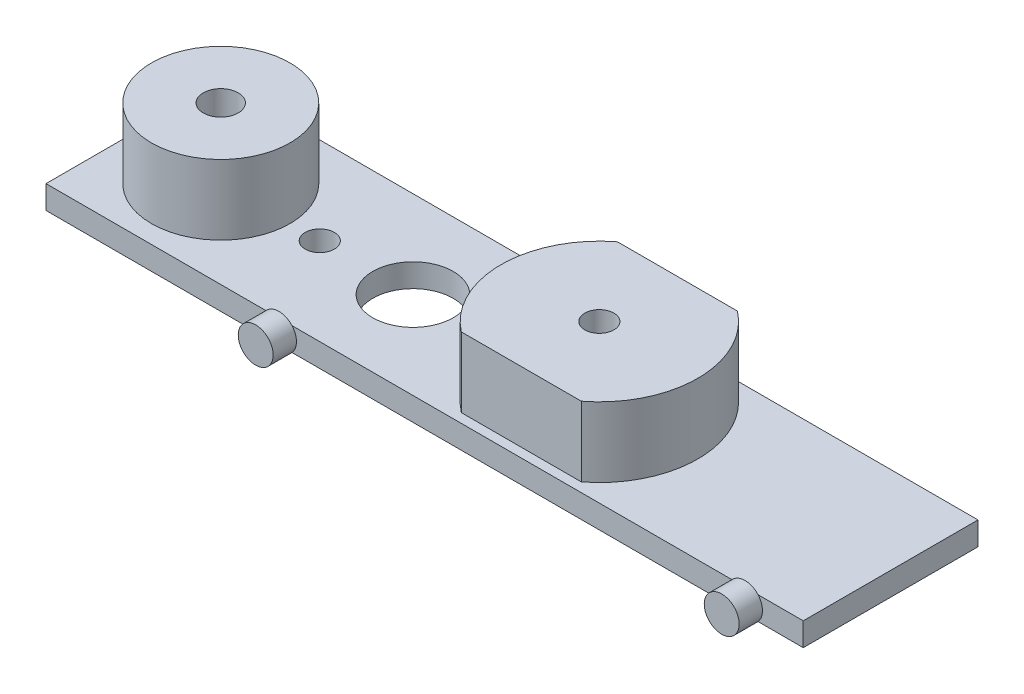
ISO-10303-21;
HEADER;
FILE_DESCRIPTION(('STEP AP214'),'2;1');
FILE_NAME('part.step','',(''),(''),'','','');
FILE_SCHEMA(('AUTOMOTIVE_DESIGN { 1 0 10303 214 1 1 1 1 }'));
ENDSEC;
DATA;
#1=APPLICATION_CONTEXT('core data for automotive mechanical design processes');
#2=APPLICATION_PROTOCOL_DEFINITION('international standard','automotive_design',2000,#1);
#3=PRODUCT_CONTEXT('',#1,'mechanical');
#4=PRODUCT('Part','Part','',(#3));
#5=PRODUCT_RELATED_PRODUCT_CATEGORY('part','',(#4));
#6=PRODUCT_DEFINITION_FORMATION('','',#4);
#7=PRODUCT_DEFINITION_CONTEXT('part definition',#1,'design');
#8=PRODUCT_DEFINITION('design','',#6,#7);
#9=PRODUCT_DEFINITION_SHAPE('','',#8);
#10=(LENGTH_UNIT() NAMED_UNIT(*) SI_UNIT(.MILLI.,.METRE.));
#11=(NAMED_UNIT(*) PLANE_ANGLE_UNIT() SI_UNIT($,.RADIAN.));
#12=(NAMED_UNIT(*) SI_UNIT($,.STERADIAN.) SOLID_ANGLE_UNIT());
#13=UNCERTAINTY_MEASURE_WITH_UNIT(LENGTH_MEASURE(1.E-05),#10,'distance_accuracy_value','');
#14=(GEOMETRIC_REPRESENTATION_CONTEXT(3) GLOBAL_UNCERTAINTY_ASSIGNED_CONTEXT((#13)) GLOBAL_UNIT_ASSIGNED_CONTEXT((#10,
#11,#12)) REPRESENTATION_CONTEXT('',''));
#15=CARTESIAN_POINT('',(0.,0.,0.));
#16=DIRECTION('',(0.,0.,1.));
#17=DIRECTION('',(1.,0.,0.));
#18=AXIS2_PLACEMENT_3D('',#15,#16,#17);
#19=CARTESIAN_POINT('',(0.,0.,0.));
#20=DIRECTION('',(0.,1.,0.));
#21=DIRECTION('',(0.,0.,1.));
#22=AXIS2_PLACEMENT_3D('',#19,#20,#21);
#23=PLANE('',#22);
#24=CARTESIAN_POINT('',(-24.,0.,0.));
#25=DIRECTION('',(0.,-1.,0.));
#26=DIRECTION('',(0.,0.,-1.));
#27=AXIS2_PLACEMENT_3D('',#24,#25,#26);
#28=CIRCLE('',#27,1.25);
#29=CARTESIAN_POINT('',(-24.,0.,-1.25));
#30=VERTEX_POINT('',#29);
#31=EDGE_CURVE('E359',#30,#30,#28,.T.);
#32=ORIENTED_EDGE('',*,*,#31,.F.);
#33=EDGE_LOOP('',(#32));
#34=FACE_BOUND('',#33,.T.);
#35=DIRECTION('',(0.,0.,-1.));
#36=VECTOR('',#35,1.);
#37=CARTESIAN_POINT('',(-40.,0.,0.));
#38=LINE('',#37,#36);
#39=CARTESIAN_POINT('',(-40.,0.,7.5));
#40=VERTEX_POINT('',#39);
#41=CARTESIAN_POINT('',(-40.,0.,-7.5));
#42=VERTEX_POINT('',#41);
#43=EDGE_CURVE('E385',#40,#42,#38,.T.);
#44=ORIENTED_EDGE('',*,*,#43,.T.);
#45=DIRECTION('',(-1.,0.,0.));
#46=VECTOR('',#45,1.);
#47=CARTESIAN_POINT('',(0.,0.,-7.5));
#48=LINE('',#47,#46);
#49=CARTESIAN_POINT('',(25.,0.,-7.5));
#50=VERTEX_POINT('',#49);
#51=EDGE_CURVE('E376',#50,#42,#48,.T.);
#52=ORIENTED_EDGE('',*,*,#51,.F.);
#53=DIRECTION('',(0.,0.,1.));
#54=VECTOR('',#53,1.);
#55=CARTESIAN_POINT('',(25.,0.,-7.5));
#56=LINE('',#55,#54);
#57=CARTESIAN_POINT('',(25.,0.,7.5));
#58=VERTEX_POINT('',#57);
#59=EDGE_CURVE('E364',#50,#58,#56,.T.);
#60=ORIENTED_EDGE('',*,*,#59,.T.);
#61=DIRECTION('',(-1.,0.,0.));
#62=VECTOR('',#61,1.);
#63=CARTESIAN_POINT('',(0.,0.,7.5));
#64=LINE('',#63,#62);
#65=CARTESIAN_POINT('',(21.1180339887499,0.,7.5));
#66=VERTEX_POINT('',#65);
#67=EDGE_CURVE('E391',#58,#66,#64,.T.);
#68=ORIENTED_EDGE('',*,*,#67,.T.);
#69=CARTESIAN_POINT('',(18.8819660112501,0.,7.5));
#70=VERTEX_POINT('',#69);
#71=EDGE_CURVE('E395',#66,#70,#64,.T.);
#72=ORIENTED_EDGE('',*,*,#71,.T.);
#73=CARTESIAN_POINT('',(-18.8819660112501,0.,7.5));
#74=VERTEX_POINT('',#73);
#75=EDGE_CURVE('E848',#70,#74,#64,.T.);
#76=ORIENTED_EDGE('',*,*,#75,.T.);
#77=CARTESIAN_POINT('',(-21.1180339887499,0.,7.5));
#78=VERTEX_POINT('',#77);
#79=EDGE_CURVE('E850',#74,#78,#64,.T.);
#80=ORIENTED_EDGE('',*,*,#79,.T.);
#81=EDGE_CURVE('E389',#78,#40,#64,.T.);
#82=ORIENTED_EDGE('',*,*,#81,.T.);
#83=EDGE_LOOP('',(#44,#52,#60,#68,#72,#76,#80,#82));
#84=FACE_BOUND('',#83,.T.);
#85=CARTESIAN_POINT('',(-16.,0.,0.));
#86=DIRECTION('',(0.,-1.,0.));
#87=DIRECTION('',(0.,0.,-1.));
#88=AXIS2_PLACEMENT_3D('',#85,#86,#87);
#89=CIRCLE('',#88,3.45);
#90=CARTESIAN_POINT('',(-16.,0.,-3.45));
#91=VERTEX_POINT('',#90);
#92=EDGE_CURVE('E360',#91,#91,#89,.T.);
#93=ORIENTED_EDGE('',*,*,#92,.F.);
#94=EDGE_LOOP('',(#93));
#95=FACE_BOUND('',#94,.T.);
#96=CARTESIAN_POINT('',(-32.5,0.,0.));
#97=DIRECTION('',(0.,1.,0.));
#98=DIRECTION('',(0.,0.,1.));
#99=AXIS2_PLACEMENT_3D('',#96,#97,#98);
#100=CIRCLE('',#99,5.25);
#101=CARTESIAN_POINT('',(-32.5,0.,5.25));
#102=VERTEX_POINT('',#101);
#103=EDGE_CURVE('E273',#102,#102,#100,.T.);
#104=ORIENTED_EDGE('',*,*,#103,.T.);
#105=EDGE_LOOP('',(#104));
#106=FACE_BOUND('',#105,.T.);
#107=DIRECTION('',(-1.,0.,0.));
#108=VECTOR('',#107,1.);
#109=CARTESIAN_POINT('',(0.,0.,6.));
#110=LINE('',#109,#108);
#111=CARTESIAN_POINT('',(4.90535421758714,0.,6.));
#112=VERTEX_POINT('',#111);
#113=CARTESIAN_POINT('',(-4.90535421758714,0.,6.));
#114=VERTEX_POINT('',#113);
#115=EDGE_CURVE('E13',#112,#114,#110,.T.);
#116=ORIENTED_EDGE('',*,*,#115,.F.);
#117=CARTESIAN_POINT('',(0.,0.,0.));
#118=DIRECTION('',(0.,1.,0.));
#119=DIRECTION('',(0.,0.,1.));
#120=AXIS2_PLACEMENT_3D('',#117,#118,#119);
#121=CIRCLE('',#120,7.75);
#122=CARTESIAN_POINT('',(4.90535421758714,0.,-6.));
#123=VERTEX_POINT('',#122);
#124=EDGE_CURVE('E422',#112,#123,#121,.T.);
#125=ORIENTED_EDGE('',*,*,#124,.T.);
#126=DIRECTION('',(-1.,0.,0.));
#127=VECTOR('',#126,1.);
#128=CARTESIAN_POINT('',(0.,0.,-6.));
#129=LINE('',#128,#127);
#130=CARTESIAN_POINT('',(-4.90535421758714,0.,-6.));
#131=VERTEX_POINT('',#130);
#132=EDGE_CURVE('E426',#123,#131,#129,.T.);
#133=ORIENTED_EDGE('',*,*,#132,.T.);
#134=CARTESIAN_POINT('',(0.,0.,0.));
#135=DIRECTION('',(0.,1.,0.));
#136=DIRECTION('',(0.,0.,1.));
#137=AXIS2_PLACEMENT_3D('',#134,#135,#136);
#138=CIRCLE('',#137,7.75);
#139=EDGE_CURVE('E131',#131,#114,#138,.T.);
#140=ORIENTED_EDGE('',*,*,#139,.T.);
#141=EDGE_LOOP('',(#116,#125,#133,#140));
#142=FACE_BOUND('',#141,.T.);
#143=ADVANCED_FACE('F121',(#34,#84,#95,#106,#142),#23,.F.);
#144=CARTESIAN_POINT('',(0.,2.,0.));
#145=DIRECTION('',(0.,1.,0.));
#146=DIRECTION('',(0.,0.,1.));
#147=AXIS2_PLACEMENT_3D('',#144,#145,#146);
#148=PLANE('',#147);
#149=DIRECTION('',(0.,0.,-1.));
#150=VECTOR('',#149,1.);
#151=CARTESIAN_POINT('',(-40.,2.,0.));
#152=LINE('',#151,#150);
#153=CARTESIAN_POINT('',(-40.,2.,7.5));
#154=VERTEX_POINT('',#153);
#155=CARTESIAN_POINT('',(-40.,2.,-7.5));
#156=VERTEX_POINT('',#155);
#157=EDGE_CURVE('E371',#154,#156,#152,.T.);
#158=ORIENTED_EDGE('',*,*,#157,.F.);
#159=DIRECTION('',(-1.,0.,0.));
#160=VECTOR('',#159,1.);
#161=CARTESIAN_POINT('',(0.,2.,7.5));
#162=LINE('',#161,#160);
#163=CARTESIAN_POINT('',(-21.1180339887499,2.,7.5));
#164=VERTEX_POINT('',#163);
#165=EDGE_CURVE('E375',#164,#154,#162,.T.);
#166=ORIENTED_EDGE('',*,*,#165,.F.);
#167=CARTESIAN_POINT('',(-18.8819660112501,2.,7.5));
#168=VERTEX_POINT('',#167);
#169=EDGE_CURVE('E832',#168,#164,#162,.T.);
#170=ORIENTED_EDGE('',*,*,#169,.F.);
#171=CARTESIAN_POINT('',(18.8819660112501,2.,7.5));
#172=VERTEX_POINT('',#171);
#173=EDGE_CURVE('E837',#172,#168,#162,.T.);
#174=ORIENTED_EDGE('',*,*,#173,.F.);
#175=CARTESIAN_POINT('',(21.1180339887499,2.,7.5));
#176=VERTEX_POINT('',#175);
#177=EDGE_CURVE('E381',#176,#172,#162,.T.);
#178=ORIENTED_EDGE('',*,*,#177,.F.);
#179=CARTESIAN_POINT('',(25.,2.,7.5));
#180=VERTEX_POINT('',#179);
#181=EDGE_CURVE('E377',#180,#176,#162,.T.);
#182=ORIENTED_EDGE('',*,*,#181,.F.);
#183=DIRECTION('',(0.,0.,1.));
#184=VECTOR('',#183,1.);
#185=CARTESIAN_POINT('',(25.,2.,-7.5));
#186=LINE('',#185,#184);
#187=CARTESIAN_POINT('',(25.,2.,-7.5));
#188=VERTEX_POINT('',#187);
#189=EDGE_CURVE('E405',#188,#180,#186,.T.);
#190=ORIENTED_EDGE('',*,*,#189,.F.);
#191=DIRECTION('',(-1.,0.,0.));
#192=VECTOR('',#191,1.);
#193=CARTESIAN_POINT('',(0.,2.,-7.5));
#194=LINE('',#193,#192);
#195=EDGE_CURVE('E380',#188,#156,#194,.T.);
#196=ORIENTED_EDGE('',*,*,#195,.T.);
#197=EDGE_LOOP('',(#158,#166,#170,#174,#178,#182,#190,#196));
#198=FACE_BOUND('',#197,.T.);
#199=CARTESIAN_POINT('',(-16.,2.,0.));
#200=DIRECTION('',(0.,1.,0.));
#201=DIRECTION('',(0.,0.,1.));
#202=AXIS2_PLACEMENT_3D('',#199,#200,#201);
#203=CIRCLE('',#202,3.45);
#204=CARTESIAN_POINT('',(-16.,2.,3.45));
#205=VERTEX_POINT('',#204);
#206=EDGE_CURVE('E339',#205,#205,#203,.F.);
#207=ORIENTED_EDGE('',*,*,#206,.T.);
#208=EDGE_LOOP('',(#207));
#209=FACE_BOUND('',#208,.T.);
#210=CARTESIAN_POINT('',(-24.,2.,0.));
#211=DIRECTION('',(0.,1.,0.));
#212=DIRECTION('',(0.,0.,1.));
#213=AXIS2_PLACEMENT_3D('',#210,#211,#212);
#214=CIRCLE('',#213,1.25);
#215=CARTESIAN_POINT('',(-24.,2.,1.25000000000001));
#216=VERTEX_POINT('',#215);
#217=EDGE_CURVE('E355',#216,#216,#214,.F.);
#218=ORIENTED_EDGE('',*,*,#217,.T.);
#219=EDGE_LOOP('',(#218));
#220=FACE_BOUND('',#219,.T.);
#221=DIRECTION('',(-1.,0.,0.));
#222=VECTOR('',#221,1.);
#223=CARTESIAN_POINT('',(5.14902903468217,2.,-6.7));
#224=LINE('',#223,#222);
#225=CARTESIAN_POINT('',(5.14902903468217,2.,-6.7));
#226=VERTEX_POINT('',#225);
#227=CARTESIAN_POINT('',(-5.14902903468217,2.,-6.7));
#228=VERTEX_POINT('',#227);
#229=EDGE_CURVE('E318',#226,#228,#224,.T.);
#230=ORIENTED_EDGE('',*,*,#229,.F.);
#231=CARTESIAN_POINT('',(0.,2.,0.));
#232=DIRECTION('',(0.,1.,0.));
#233=DIRECTION('',(0.,0.,1.));
#234=AXIS2_PLACEMENT_3D('',#231,#232,#233);
#235=CIRCLE('',#234,8.45);
#236=CARTESIAN_POINT('',(5.14902903468217,2.,6.7));
#237=VERTEX_POINT('',#236);
#238=EDGE_CURVE('E297',#237,#226,#235,.T.);
#239=ORIENTED_EDGE('',*,*,#238,.F.);
#240=DIRECTION('',(1.,0.,0.));
#241=VECTOR('',#240,1.);
#242=CARTESIAN_POINT('',(5.14902903468217,2.,6.7));
#243=LINE('',#242,#241);
#244=CARTESIAN_POINT('',(-5.14902903468217,2.,6.7));
#245=VERTEX_POINT('',#244);
#246=EDGE_CURVE('E311',#245,#237,#243,.T.);
#247=ORIENTED_EDGE('',*,*,#246,.F.);
#248=CARTESIAN_POINT('',(0.,2.,0.));
#249=DIRECTION('',(0.,1.,0.));
#250=DIRECTION('',(0.,0.,1.));
#251=AXIS2_PLACEMENT_3D('',#248,#249,#250);
#252=CIRCLE('',#251,8.45);
#253=EDGE_CURVE('E314',#228,#245,#252,.T.);
#254=ORIENTED_EDGE('',*,*,#253,.F.);
#255=EDGE_LOOP('',(#230,#239,#247,#254));
#256=FACE_BOUND('',#255,.T.);
#257=CARTESIAN_POINT('',(-32.5,2.,0.));
#258=DIRECTION('',(0.,1.,0.));
#259=DIRECTION('',(0.,0.,1.));
#260=AXIS2_PLACEMENT_3D('',#257,#258,#259);
#261=CIRCLE('',#260,5.95);
#262=CARTESIAN_POINT('',(-32.5,2.,5.95));
#263=VERTEX_POINT('',#262);
#264=EDGE_CURVE('E293',#263,#263,#261,.T.);
#265=ORIENTED_EDGE('',*,*,#264,.F.);
#266=EDGE_LOOP('',(#265));
#267=FACE_BOUND('',#266,.T.);
#268=ADVANCED_FACE('F452',(#198,#209,#220,#256,#267),#148,.T.);
#269=CARTESIAN_POINT('',(0.,2.,7.5));
#270=DIRECTION('',(0.,0.,1.));
#271=DIRECTION('',(1.,0.,0.));
#272=AXIS2_PLACEMENT_3D('',#269,#270,#271);
#273=PLANE('',#272);
#274=CARTESIAN_POINT('',(20.,0.999999999999999,7.5));
#275=DIRECTION('',(0.,0.,1.));
#276=DIRECTION('',(1.,0.,0.));
#277=AXIS2_PLACEMENT_3D('',#274,#275,#276);
#278=CIRCLE('',#277,1.5);
#279=EDGE_CURVE('E427',#172,#70,#278,.T.);
#280=ORIENTED_EDGE('',*,*,#279,.F.);
#281=ORIENTED_EDGE('',*,*,#173,.T.);
#282=CARTESIAN_POINT('',(-20.,0.999999999999995,7.5));
#283=DIRECTION('',(0.,0.,1.));
#284=DIRECTION('',(1.,0.,0.));
#285=AXIS2_PLACEMENT_3D('',#282,#283,#284);
#286=CIRCLE('',#285,1.5);
#287=EDGE_CURVE('E351',#74,#168,#286,.T.);
#288=ORIENTED_EDGE('',*,*,#287,.F.);
#289=ORIENTED_EDGE('',*,*,#75,.F.);
#290=EDGE_LOOP('',(#280,#281,#288,#289));
#291=FACE_BOUND('',#290,.T.);
#292=ADVANCED_FACE('F459',(#291),#273,.T.);
#293=EDGE_CURVE('E820',#164,#78,#286,.T.);
#294=ORIENTED_EDGE('',*,*,#293,.F.);
#295=ORIENTED_EDGE('',*,*,#165,.T.);
#296=DIRECTION('',(0.,-1.,0.));
#297=VECTOR('',#296,1.);
#298=CARTESIAN_POINT('',(-40.,2.,7.5));
#299=LINE('',#298,#297);
#300=EDGE_CURVE('E401',#154,#40,#299,.T.);
#301=ORIENTED_EDGE('',*,*,#300,.T.);
#302=ORIENTED_EDGE('',*,*,#81,.F.);
#303=EDGE_LOOP('',(#294,#295,#301,#302));
#304=FACE_BOUND('',#303,.T.);
#305=ADVANCED_FACE('F470',(#304),#273,.T.);
#306=CARTESIAN_POINT('',(0.,2.,-7.5));
#307=DIRECTION('',(0.,0.,1.));
#308=DIRECTION('',(1.,0.,0.));
#309=AXIS2_PLACEMENT_3D('',#306,#307,#308);
#310=PLANE('',#309);
#311=ORIENTED_EDGE('',*,*,#51,.T.);
#312=DIRECTION('',(0.,-1.,0.));
#313=VECTOR('',#312,1.);
#314=CARTESIAN_POINT('',(-40.,2.,-7.5));
#315=LINE('',#314,#313);
#316=EDGE_CURVE('E384',#156,#42,#315,.T.);
#317=ORIENTED_EDGE('',*,*,#316,.F.);
#318=ORIENTED_EDGE('',*,*,#195,.F.);
#319=DIRECTION('',(0.,-1.,0.));
#320=VECTOR('',#319,1.);
#321=CARTESIAN_POINT('',(25.,2.,-7.5));
#322=LINE('',#321,#320);
#323=EDGE_CURVE('E409',#188,#50,#322,.T.);
#324=ORIENTED_EDGE('',*,*,#323,.T.);
#325=EDGE_LOOP('',(#311,#317,#318,#324));
#326=FACE_BOUND('',#325,.T.);
#327=ADVANCED_FACE('F466',(#326),#310,.F.);
#328=EDGE_CURVE('E345',#66,#176,#278,.T.);
#329=ORIENTED_EDGE('',*,*,#328,.F.);
#330=ORIENTED_EDGE('',*,*,#67,.F.);
#331=DIRECTION('',(0.,-1.,0.));
#332=VECTOR('',#331,1.);
#333=CARTESIAN_POINT('',(25.,2.,7.5));
#334=LINE('',#333,#332);
#335=EDGE_CURVE('E390',#180,#58,#334,.T.);
#336=ORIENTED_EDGE('',*,*,#335,.F.);
#337=ORIENTED_EDGE('',*,*,#181,.T.);
#338=EDGE_LOOP('',(#329,#330,#336,#337));
#339=FACE_BOUND('',#338,.T.);
#340=ADVANCED_FACE('F469',(#339),#273,.T.);
#341=CARTESIAN_POINT('',(-40.,2.,0.));
#342=DIRECTION('',(-1.,0.,0.));
#343=DIRECTION('',(0.,0.,1.));
#344=AXIS2_PLACEMENT_3D('',#341,#342,#343);
#345=PLANE('',#344);
#346=ORIENTED_EDGE('',*,*,#43,.F.);
#347=ORIENTED_EDGE('',*,*,#300,.F.);
#348=ORIENTED_EDGE('',*,*,#157,.T.);
#349=ORIENTED_EDGE('',*,*,#316,.T.);
#350=EDGE_LOOP('',(#346,#347,#348,#349));
#351=FACE_BOUND('',#350,.T.);
#352=ADVANCED_FACE('F473',(#351),#345,.T.);
#353=CARTESIAN_POINT('',(25.,2.,-7.5));
#354=DIRECTION('',(1.,0.,0.));
#355=DIRECTION('',(0.,0.,-1.));
#356=AXIS2_PLACEMENT_3D('',#353,#354,#355);
#357=PLANE('',#356);
#358=ORIENTED_EDGE('',*,*,#59,.F.);
#359=ORIENTED_EDGE('',*,*,#323,.F.);
#360=ORIENTED_EDGE('',*,*,#189,.T.);
#361=ORIENTED_EDGE('',*,*,#335,.T.);
#362=EDGE_LOOP('',(#358,#359,#360,#361));
#363=FACE_BOUND('',#362,.T.);
#364=ADVANCED_FACE('F123',(#363),#357,.T.);
#365=CARTESIAN_POINT('',(-16.,11.7580735803744,0.));
#366=DIRECTION('',(0.,-1.,0.));
#367=DIRECTION('',(0.,0.,-1.));
#368=AXIS2_PLACEMENT_3D('',#365,#366,#367);
#369=CYLINDRICAL_SURFACE('',#368,3.45);
#370=ORIENTED_EDGE('',*,*,#92,.T.);
#371=EDGE_LOOP('',(#370));
#372=FACE_BOUND('',#371,.T.);
#373=ORIENTED_EDGE('',*,*,#206,.F.);
#374=EDGE_LOOP('',(#373));
#375=FACE_BOUND('',#374,.T.);
#376=ADVANCED_FACE('F477',(#372,#375),#369,.F.);
#377=CARTESIAN_POINT('',(-24.,11.7580735803744,0.));
#378=DIRECTION('',(0.,-1.,0.));
#379=DIRECTION('',(0.,0.,-1.));
#380=AXIS2_PLACEMENT_3D('',#377,#378,#379);
#381=CYLINDRICAL_SURFACE('',#380,1.25);
#382=ORIENTED_EDGE('',*,*,#31,.T.);
#383=EDGE_LOOP('',(#382));
#384=FACE_BOUND('',#383,.T.);
#385=ORIENTED_EDGE('',*,*,#217,.F.);
#386=EDGE_LOOP('',(#385));
#387=FACE_BOUND('',#386,.T.);
#388=ADVANCED_FACE('F484',(#384,#387),#381,.F.);
#389=CARTESIAN_POINT('',(0.,11.7580735803744,0.));
#390=DIRECTION('',(0.,-1.,0.));
#391=DIRECTION('',(0.,0.,-1.));
#392=AXIS2_PLACEMENT_3D('',#389,#390,#391);
#393=CYLINDRICAL_SURFACE('',#392,1.25);
#394=CARTESIAN_POINT('',(0.,5.5,0.));
#395=DIRECTION('',(0.,1.,0.));
#396=DIRECTION('',(0.,0.,1.));
#397=AXIS2_PLACEMENT_3D('',#394,#395,#396);
#398=CIRCLE('',#397,1.25);
#399=CARTESIAN_POINT('',(0.,5.5,1.25));
#400=VERTEX_POINT('',#399);
#401=EDGE_CURVE('E258',#400,#400,#398,.F.);
#402=ORIENTED_EDGE('',*,*,#401,.T.);
#403=EDGE_LOOP('',(#402));
#404=FACE_BOUND('',#403,.T.);
#405=CARTESIAN_POINT('',(0.,8.,0.));
#406=DIRECTION('',(0.,1.,0.));
#407=DIRECTION('',(0.,0.,1.));
#408=AXIS2_PLACEMENT_3D('',#405,#406,#407);
#409=CIRCLE('',#408,1.25);
#410=CARTESIAN_POINT('',(0.,8.,1.25));
#411=VERTEX_POINT('',#410);
#412=EDGE_CURVE('E283',#411,#411,#409,.F.);
#413=ORIENTED_EDGE('',*,*,#412,.F.);
#414=EDGE_LOOP('',(#413));
#415=FACE_BOUND('',#414,.T.);
#416=ADVANCED_FACE('F489',(#404,#415),#393,.F.);
#417=CARTESIAN_POINT('',(-20.,0.999999999999995,7.5));
#418=DIRECTION('',(0.,0.,1.));
#419=DIRECTION('',(1.,0.,0.));
#420=AXIS2_PLACEMENT_3D('',#417,#418,#419);
#421=PLANE('',#420);
#422=EDGE_CURVE('E346',#168,#164,#286,.T.);
#423=ORIENTED_EDGE('',*,*,#422,.F.);
#424=ORIENTED_EDGE('',*,*,#169,.T.);
#425=EDGE_LOOP('',(#423,#424));
#426=FACE_BOUND('',#425,.T.);
#427=ADVANCED_FACE('F495',(#426),#421,.F.);
#428=CARTESIAN_POINT('',(-20.,0.999999999999995,9.5));
#429=DIRECTION('',(0.,0.,-1.));
#430=DIRECTION('',(-1.,0.,0.));
#431=AXIS2_PLACEMENT_3D('',#428,#429,#430);
#432=CYLINDRICAL_SURFACE('',#431,1.5);
#433=CARTESIAN_POINT('',(-20.,0.999999999999995,9.5));
#434=DIRECTION('',(0.,0.,1.));
#435=DIRECTION('',(1.,0.,0.));
#436=AXIS2_PLACEMENT_3D('',#433,#434,#435);
#437=CIRCLE('',#436,1.5);
#438=CARTESIAN_POINT('',(-18.5,0.999999999999995,9.5));
#439=VERTEX_POINT('',#438);
#440=EDGE_CURVE('E292',#439,#439,#437,.T.);
#441=ORIENTED_EDGE('',*,*,#440,.F.);
#442=EDGE_LOOP('',(#441));
#443=FACE_BOUND('',#442,.T.);
#444=ORIENTED_EDGE('',*,*,#422,.T.);
#445=ORIENTED_EDGE('',*,*,#293,.T.);
#446=EDGE_CURVE('E350',#78,#74,#286,.T.);
#447=ORIENTED_EDGE('',*,*,#446,.T.);
#448=ORIENTED_EDGE('',*,*,#287,.T.);
#449=EDGE_LOOP('',(#444,#445,#447,#448));
#450=FACE_BOUND('',#449,.T.);
#451=ADVANCED_FACE('F501',(#443,#450),#432,.T.);
#452=CARTESIAN_POINT('',(-20.,0.999999999999995,9.5));
#453=DIRECTION('',(0.,0.,1.));
#454=DIRECTION('',(1.,0.,0.));
#455=AXIS2_PLACEMENT_3D('',#452,#453,#454);
#456=PLANE('',#455);
#457=ORIENTED_EDGE('',*,*,#440,.T.);
#458=EDGE_LOOP('',(#457));
#459=FACE_BOUND('',#458,.T.);
#460=ADVANCED_FACE('F497',(#459),#456,.T.);
#461=ORIENTED_EDGE('',*,*,#79,.F.);
#462=ORIENTED_EDGE('',*,*,#446,.F.);
#463=EDGE_LOOP('',(#461,#462));
#464=FACE_BOUND('',#463,.T.);
#465=ADVANCED_FACE('F500',(#464),#421,.F.);
#466=CARTESIAN_POINT('',(20.,0.999999999999999,7.5));
#467=DIRECTION('',(0.,0.,1.));
#468=DIRECTION('',(1.,0.,0.));
#469=AXIS2_PLACEMENT_3D('',#466,#467,#468);
#470=PLANE('',#469);
#471=EDGE_CURVE('E340',#176,#172,#278,.T.);
#472=ORIENTED_EDGE('',*,*,#471,.F.);
#473=ORIENTED_EDGE('',*,*,#177,.T.);
#474=EDGE_LOOP('',(#472,#473));
#475=FACE_BOUND('',#474,.T.);
#476=ADVANCED_FACE('F505',(#475),#470,.F.);
#477=CARTESIAN_POINT('',(20.,0.999999999999999,9.5));
#478=DIRECTION('',(0.,0.,-1.));
#479=DIRECTION('',(-1.,0.,0.));
#480=AXIS2_PLACEMENT_3D('',#477,#478,#479);
#481=CYLINDRICAL_SURFACE('',#480,1.5);
#482=CARTESIAN_POINT('',(20.,0.999999999999999,9.5));
#483=DIRECTION('',(0.,0.,1.));
#484=DIRECTION('',(1.,0.,0.));
#485=AXIS2_PLACEMENT_3D('',#482,#483,#484);
#486=CIRCLE('',#485,1.5);
#487=CARTESIAN_POINT('',(21.5,0.999999999999999,9.5));
#488=VERTEX_POINT('',#487);
#489=EDGE_CURVE('E335',#488,#488,#486,.T.);
#490=ORIENTED_EDGE('',*,*,#489,.F.);
#491=EDGE_LOOP('',(#490));
#492=FACE_BOUND('',#491,.T.);
#493=ORIENTED_EDGE('',*,*,#471,.T.);
#494=ORIENTED_EDGE('',*,*,#279,.T.);
#495=EDGE_CURVE('E344',#70,#66,#278,.T.);
#496=ORIENTED_EDGE('',*,*,#495,.T.);
#497=ORIENTED_EDGE('',*,*,#328,.T.);
#498=EDGE_LOOP('',(#493,#494,#496,#497));
#499=FACE_BOUND('',#498,.T.);
#500=ADVANCED_FACE('F510',(#492,#499),#481,.T.);
#501=CARTESIAN_POINT('',(20.,0.999999999999999,9.5));
#502=DIRECTION('',(0.,0.,1.));
#503=DIRECTION('',(1.,0.,0.));
#504=AXIS2_PLACEMENT_3D('',#501,#502,#503);
#505=PLANE('',#504);
#506=ORIENTED_EDGE('',*,*,#489,.T.);
#507=EDGE_LOOP('',(#506));
#508=FACE_BOUND('',#507,.T.);
#509=ADVANCED_FACE('F513',(#508),#505,.T.);
#510=ORIENTED_EDGE('',*,*,#71,.F.);
#511=ORIENTED_EDGE('',*,*,#495,.F.);
#512=EDGE_LOOP('',(#510,#511));
#513=FACE_BOUND('',#512,.T.);
#514=ADVANCED_FACE('F515',(#513),#470,.F.);
#515=CARTESIAN_POINT('',(0.,8.,0.));
#516=DIRECTION('',(0.,1.,0.));
#517=DIRECTION('',(0.,0.,1.));
#518=AXIS2_PLACEMENT_3D('',#515,#516,#517);
#519=PLANE('',#518);
#520=CARTESIAN_POINT('',(0.,8.,0.));
#521=DIRECTION('',(0.,1.,0.));
#522=DIRECTION('',(0.,0.,1.));
#523=AXIS2_PLACEMENT_3D('',#520,#521,#522);
#524=CIRCLE('',#523,8.45);
#525=CARTESIAN_POINT('',(5.14902903468217,8.,6.7));
#526=VERTEX_POINT('',#525);
#527=CARTESIAN_POINT('',(5.14902903468217,8.,-6.7));
#528=VERTEX_POINT('',#527);
#529=EDGE_CURVE('E315',#526,#528,#524,.T.);
#530=ORIENTED_EDGE('',*,*,#529,.T.);
#531=DIRECTION('',(-1.,0.,0.));
#532=VECTOR('',#531,1.);
#533=CARTESIAN_POINT('',(5.14902903468217,8.,-6.7));
#534=LINE('',#533,#532);
#535=CARTESIAN_POINT('',(-5.14902903468217,8.,-6.7));
#536=VERTEX_POINT('',#535);
#537=EDGE_CURVE('E329',#528,#536,#534,.T.);
#538=ORIENTED_EDGE('',*,*,#537,.T.);
#539=CARTESIAN_POINT('',(0.,8.,0.));
#540=DIRECTION('',(0.,1.,0.));
#541=DIRECTION('',(0.,0.,1.));
#542=AXIS2_PLACEMENT_3D('',#539,#540,#541);
#543=CIRCLE('',#542,8.45);
#544=CARTESIAN_POINT('',(-5.14902903468217,8.,6.7));
#545=VERTEX_POINT('',#544);
#546=EDGE_CURVE('E326',#536,#545,#543,.T.);
#547=ORIENTED_EDGE('',*,*,#546,.T.);
#548=DIRECTION('',(1.,0.,0.));
#549=VECTOR('',#548,1.);
#550=CARTESIAN_POINT('',(5.14902903468217,8.,6.7));
#551=LINE('',#550,#549);
#552=EDGE_CURVE('E310',#545,#526,#551,.T.);
#553=ORIENTED_EDGE('',*,*,#552,.T.);
#554=EDGE_LOOP('',(#530,#538,#547,#553));
#555=FACE_BOUND('',#554,.T.);
#556=ORIENTED_EDGE('',*,*,#412,.T.);
#557=EDGE_LOOP('',(#556));
#558=FACE_BOUND('',#557,.T.);
#559=ADVANCED_FACE('F518',(#555,#558),#519,.T.);
#560=CARTESIAN_POINT('',(0.,8.,0.));
#561=DIRECTION('',(0.,-1.,0.));
#562=DIRECTION('',(0.,0.,-1.));
#563=AXIS2_PLACEMENT_3D('',#560,#561,#562);
#564=CYLINDRICAL_SURFACE('',#563,8.45);
#565=ORIENTED_EDGE('',*,*,#238,.T.);
#566=DIRECTION('',(0.,-1.,0.));
#567=VECTOR('',#566,1.);
#568=CARTESIAN_POINT('',(5.14902903468217,8.,-6.7));
#569=LINE('',#568,#567);
#570=EDGE_CURVE('E287',#528,#226,#569,.T.);
#571=ORIENTED_EDGE('',*,*,#570,.F.);
#572=ORIENTED_EDGE('',*,*,#529,.F.);
#573=DIRECTION('',(0.,-1.,0.));
#574=VECTOR('',#573,1.);
#575=CARTESIAN_POINT('',(5.14902903468217,8.,6.7));
#576=LINE('',#575,#574);
#577=EDGE_CURVE('E306',#526,#237,#576,.T.);
#578=ORIENTED_EDGE('',*,*,#577,.T.);
#579=EDGE_LOOP('',(#565,#571,#572,#578));
#580=FACE_BOUND('',#579,.T.);
#581=ADVANCED_FACE('F524',(#580),#564,.T.);
#582=CARTESIAN_POINT('',(5.14902903468217,8.,-6.7));
#583=DIRECTION('',(0.,0.,1.));
#584=DIRECTION('',(1.,0.,0.));
#585=AXIS2_PLACEMENT_3D('',#582,#583,#584);
#586=PLANE('',#585);
#587=ORIENTED_EDGE('',*,*,#229,.T.);
#588=DIRECTION('',(0.,-1.,0.));
#589=VECTOR('',#588,1.);
#590=CARTESIAN_POINT('',(-5.14902903468217,8.,-6.7));
#591=LINE('',#590,#589);
#592=EDGE_CURVE('E300',#536,#228,#591,.T.);
#593=ORIENTED_EDGE('',*,*,#592,.F.);
#594=ORIENTED_EDGE('',*,*,#537,.F.);
#595=ORIENTED_EDGE('',*,*,#570,.T.);
#596=EDGE_LOOP('',(#587,#593,#594,#595));
#597=FACE_BOUND('',#596,.T.);
#598=ADVANCED_FACE('F532',(#597),#586,.F.);
#599=CARTESIAN_POINT('',(0.,8.,0.));
#600=DIRECTION('',(0.,-1.,0.));
#601=DIRECTION('',(0.,0.,-1.));
#602=AXIS2_PLACEMENT_3D('',#599,#600,#601);
#603=CYLINDRICAL_SURFACE('',#602,8.45);
#604=ORIENTED_EDGE('',*,*,#253,.T.);
#605=DIRECTION('',(0.,-1.,0.));
#606=VECTOR('',#605,1.);
#607=CARTESIAN_POINT('',(-5.14902903468217,8.,6.7));
#608=LINE('',#607,#606);
#609=EDGE_CURVE('E146',#545,#245,#608,.T.);
#610=ORIENTED_EDGE('',*,*,#609,.F.);
#611=ORIENTED_EDGE('',*,*,#546,.F.);
#612=ORIENTED_EDGE('',*,*,#592,.T.);
#613=EDGE_LOOP('',(#604,#610,#611,#612));
#614=FACE_BOUND('',#613,.T.);
#615=ADVANCED_FACE('F529',(#614),#603,.T.);
#616=CARTESIAN_POINT('',(5.14902903468217,8.,6.7));
#617=DIRECTION('',(0.,0.,-1.));
#618=DIRECTION('',(-1.,0.,0.));
#619=AXIS2_PLACEMENT_3D('',#616,#617,#618);
#620=PLANE('',#619);
#621=ORIENTED_EDGE('',*,*,#246,.T.);
#622=ORIENTED_EDGE('',*,*,#577,.F.);
#623=ORIENTED_EDGE('',*,*,#552,.F.);
#624=ORIENTED_EDGE('',*,*,#609,.T.);
#625=EDGE_LOOP('',(#621,#622,#623,#624));
#626=FACE_BOUND('',#625,.T.);
#627=ADVANCED_FACE('F526',(#626),#620,.F.);
#628=CARTESIAN_POINT('',(-32.5,8.,0.));
#629=DIRECTION('',(0.,1.,0.));
#630=DIRECTION('',(0.,0.,1.));
#631=AXIS2_PLACEMENT_3D('',#628,#629,#630);
#632=PLANE('',#631);
#633=CARTESIAN_POINT('',(-32.5,8.,0.));
#634=DIRECTION('',(0.,1.,0.));
#635=DIRECTION('',(0.,0.,1.));
#636=AXIS2_PLACEMENT_3D('',#633,#634,#635);
#637=CIRCLE('',#636,1.5);
#638=CARTESIAN_POINT('',(-32.5,8.,1.5));
#639=VERTEX_POINT('',#638);
#640=EDGE_CURVE('E603',#639,#639,#637,.T.);
#641=ORIENTED_EDGE('',*,*,#640,.F.);
#642=EDGE_LOOP('',(#641));
#643=FACE_BOUND('',#642,.T.);
#644=CARTESIAN_POINT('',(-32.5,8.,0.));
#645=DIRECTION('',(0.,1.,0.));
#646=DIRECTION('',(0.,0.,1.));
#647=AXIS2_PLACEMENT_3D('',#644,#645,#646);
#648=CIRCLE('',#647,5.95);
#649=CARTESIAN_POINT('',(-32.5,8.,5.95));
#650=VERTEX_POINT('',#649);
#651=EDGE_CURVE('E288',#650,#650,#648,.T.);
#652=ORIENTED_EDGE('',*,*,#651,.T.);
#653=EDGE_LOOP('',(#652));
#654=FACE_BOUND('',#653,.T.);
#655=ADVANCED_FACE('F446',(#643,#654),#632,.T.);
#656=CARTESIAN_POINT('',(-32.5,8.,0.));
#657=DIRECTION('',(0.,-1.,0.));
#658=DIRECTION('',(0.,0.,-1.));
#659=AXIS2_PLACEMENT_3D('',#656,#657,#658);
#660=CYLINDRICAL_SURFACE('',#659,5.95);
#661=ORIENTED_EDGE('',*,*,#651,.F.);
#662=EDGE_LOOP('',(#661));
#663=FACE_BOUND('',#662,.T.);
#664=ORIENTED_EDGE('',*,*,#264,.T.);
#665=EDGE_LOOP('',(#664));
#666=FACE_BOUND('',#665,.T.);
#667=ADVANCED_FACE('F438',(#663,#666),#660,.T.);
#668=CARTESIAN_POINT('',(0.,-0.500000000000006,6.));
#669=DIRECTION('',(0.,0.,-1.));
#670=DIRECTION('',(-1.,0.,0.));
#671=AXIS2_PLACEMENT_3D('',#668,#669,#670);
#672=PLANE('',#671);
#673=ORIENTED_EDGE('',*,*,#115,.T.);
#674=DIRECTION('',(0.,1.,0.));
#675=VECTOR('',#674,1.);
#676=CARTESIAN_POINT('',(-4.90535421758714,-0.500000000000006,6.));
#677=LINE('',#676,#675);
#678=CARTESIAN_POINT('',(-4.90535421758714,5.5,6.));
#679=VERTEX_POINT('',#678);
#680=EDGE_CURVE('E246',#114,#679,#677,.T.);
#681=ORIENTED_EDGE('',*,*,#680,.T.);
#682=DIRECTION('',(-1.,0.,0.));
#683=VECTOR('',#682,1.);
#684=CARTESIAN_POINT('',(0.,5.5,6.));
#685=LINE('',#684,#683);
#686=CARTESIAN_POINT('',(4.90535421758714,5.50000000000001,6.));
#687=VERTEX_POINT('',#686);
#688=EDGE_CURVE('E256',#687,#679,#685,.T.);
#689=ORIENTED_EDGE('',*,*,#688,.F.);
#690=DIRECTION('',(0.,1.,0.));
#691=VECTOR('',#690,1.);
#692=CARTESIAN_POINT('',(4.90535421758714,-0.500000000000006,6.));
#693=LINE('',#692,#691);
#694=EDGE_CURVE('E277',#112,#687,#693,.T.);
#695=ORIENTED_EDGE('',*,*,#694,.F.);
#696=EDGE_LOOP('',(#673,#681,#689,#695));
#697=FACE_BOUND('',#696,.T.);
#698=ADVANCED_FACE('F436',(#697),#672,.T.);
#699=CARTESIAN_POINT('',(0.,-0.500000000000006,0.));
#700=DIRECTION('',(0.,1.,0.));
#701=DIRECTION('',(0.,0.,1.));
#702=AXIS2_PLACEMENT_3D('',#699,#700,#701);
#703=CYLINDRICAL_SURFACE('',#702,7.75);
#704=DIRECTION('',(0.,1.,0.));
#705=VECTOR('',#704,1.);
#706=CARTESIAN_POINT('',(-4.90535421758714,-0.500000000000006,-6.));
#707=LINE('',#706,#705);
#708=CARTESIAN_POINT('',(-4.90535421758714,5.50000000000001,-6.));
#709=VERTEX_POINT('',#708);
#710=EDGE_CURVE('E236',#131,#709,#707,.T.);
#711=ORIENTED_EDGE('',*,*,#710,.T.);
#712=CARTESIAN_POINT('',(0.,5.5,0.));
#713=DIRECTION('',(0.,1.,0.));
#714=DIRECTION('',(0.,0.,1.));
#715=AXIS2_PLACEMENT_3D('',#712,#713,#714);
#716=CIRCLE('',#715,7.75);
#717=EDGE_CURVE('E240',#709,#679,#716,.T.);
#718=ORIENTED_EDGE('',*,*,#717,.T.);
#719=ORIENTED_EDGE('',*,*,#680,.F.);
#720=ORIENTED_EDGE('',*,*,#139,.F.);
#721=EDGE_LOOP('',(#711,#718,#719,#720));
#722=FACE_BOUND('',#721,.T.);
#723=ADVANCED_FACE('F238',(#722),#703,.F.);
#724=CARTESIAN_POINT('',(0.,-0.500000000000006,-6.));
#725=DIRECTION('',(0.,0.,-1.));
#726=DIRECTION('',(-1.,0.,0.));
#727=AXIS2_PLACEMENT_3D('',#724,#725,#726);
#728=PLANE('',#727);
#729=DIRECTION('',(0.,1.,0.));
#730=VECTOR('',#729,1.);
#731=CARTESIAN_POINT('',(4.90535421758714,-0.500000000000006,-6.));
#732=LINE('',#731,#730);
#733=CARTESIAN_POINT('',(4.90535421758714,5.50000000000001,-6.));
#734=VERTEX_POINT('',#733);
#735=EDGE_CURVE('E138',#123,#734,#732,.T.);
#736=ORIENTED_EDGE('',*,*,#735,.T.);
#737=DIRECTION('',(-1.,0.,0.));
#738=VECTOR('',#737,1.);
#739=CARTESIAN_POINT('',(0.,5.5,-6.));
#740=LINE('',#739,#738);
#741=EDGE_CURVE('E254',#734,#709,#740,.T.);
#742=ORIENTED_EDGE('',*,*,#741,.T.);
#743=ORIENTED_EDGE('',*,*,#710,.F.);
#744=ORIENTED_EDGE('',*,*,#132,.F.);
#745=EDGE_LOOP('',(#736,#742,#743,#744));
#746=FACE_BOUND('',#745,.T.);
#747=ADVANCED_FACE('F260',(#746),#728,.F.);
#748=CARTESIAN_POINT('',(0.,-0.500000000000006,0.));
#749=DIRECTION('',(0.,1.,0.));
#750=DIRECTION('',(0.,0.,1.));
#751=AXIS2_PLACEMENT_3D('',#748,#749,#750);
#752=CYLINDRICAL_SURFACE('',#751,7.75);
#753=ORIENTED_EDGE('',*,*,#694,.T.);
#754=CARTESIAN_POINT('',(0.,5.5,0.));
#755=DIRECTION('',(0.,1.,0.));
#756=DIRECTION('',(0.,0.,1.));
#757=AXIS2_PLACEMENT_3D('',#754,#755,#756);
#758=CIRCLE('',#757,7.75);
#759=EDGE_CURVE('E262',#687,#734,#758,.T.);
#760=ORIENTED_EDGE('',*,*,#759,.T.);
#761=ORIENTED_EDGE('',*,*,#735,.F.);
#762=ORIENTED_EDGE('',*,*,#124,.F.);
#763=EDGE_LOOP('',(#753,#760,#761,#762));
#764=FACE_BOUND('',#763,.T.);
#765=ADVANCED_FACE('F434',(#764),#752,.F.);
#766=CARTESIAN_POINT('',(0.,5.5,0.));
#767=DIRECTION('',(0.,1.,0.));
#768=DIRECTION('',(0.,0.,1.));
#769=AXIS2_PLACEMENT_3D('',#766,#767,#768);
#770=PLANE('',#769);
#771=ORIENTED_EDGE('',*,*,#688,.T.);
#772=ORIENTED_EDGE('',*,*,#717,.F.);
#773=ORIENTED_EDGE('',*,*,#741,.F.);
#774=ORIENTED_EDGE('',*,*,#759,.F.);
#775=EDGE_LOOP('',(#771,#772,#773,#774));
#776=FACE_BOUND('',#775,.T.);
#777=ORIENTED_EDGE('',*,*,#401,.F.);
#778=EDGE_LOOP('',(#777));
#779=FACE_BOUND('',#778,.T.);
#780=ADVANCED_FACE('F251',(#776,#779),#770,.F.);
#781=CARTESIAN_POINT('',(-32.5,-0.500000000000006,0.));
#782=DIRECTION('',(0.,1.,0.));
#783=DIRECTION('',(0.,0.,1.));
#784=AXIS2_PLACEMENT_3D('',#781,#782,#783);
#785=CYLINDRICAL_SURFACE('',#784,5.25);
#786=CARTESIAN_POINT('',(-32.5,5.5,0.));
#787=DIRECTION('',(0.,1.,0.));
#788=DIRECTION('',(0.,0.,1.));
#789=AXIS2_PLACEMENT_3D('',#786,#787,#788);
#790=CIRCLE('',#789,5.25);
#791=CARTESIAN_POINT('',(-32.5,5.5,5.25));
#792=VERTEX_POINT('',#791);
#793=EDGE_CURVE('E270',#792,#792,#790,.T.);
#794=ORIENTED_EDGE('',*,*,#793,.T.);
#795=EDGE_LOOP('',(#794));
#796=FACE_BOUND('',#795,.T.);
#797=ORIENTED_EDGE('',*,*,#103,.F.);
#798=EDGE_LOOP('',(#797));
#799=FACE_BOUND('',#798,.T.);
#800=ADVANCED_FACE('F546',(#796,#799),#785,.F.);
#801=CARTESIAN_POINT('',(0.,5.5,0.));
#802=DIRECTION('',(0.,1.,0.));
#803=DIRECTION('',(0.,0.,1.));
#804=AXIS2_PLACEMENT_3D('',#801,#802,#803);
#805=PLANE('',#804);
#806=CARTESIAN_POINT('',(-32.5,5.5,0.));
#807=DIRECTION('',(0.,1.,0.));
#808=DIRECTION('',(0.,0.,1.));
#809=AXIS2_PLACEMENT_3D('',#806,#807,#808);
#810=CIRCLE('',#809,1.5);
#811=CARTESIAN_POINT('',(-32.5,5.5,1.5));
#812=VERTEX_POINT('',#811);
#813=EDGE_CURVE('E125',#812,#812,#810,.F.);
#814=ORIENTED_EDGE('',*,*,#813,.F.);
#815=EDGE_LOOP('',(#814));
#816=FACE_BOUND('',#815,.T.);
#817=ORIENTED_EDGE('',*,*,#793,.F.);
#818=EDGE_LOOP('',(#817));
#819=FACE_BOUND('',#818,.T.);
#820=ADVANCED_FACE('F543',(#816,#819),#805,.F.);
#821=CARTESIAN_POINT('',(-32.5,12.2426406871193,0.));
#822=DIRECTION('',(0.,-1.,0.));
#823=DIRECTION('',(0.,0.,-1.));
#824=AXIS2_PLACEMENT_3D('',#821,#822,#823);
#825=CYLINDRICAL_SURFACE('',#824,1.5);
#826=ORIENTED_EDGE('',*,*,#640,.T.);
#827=EDGE_LOOP('',(#826));
#828=FACE_BOUND('',#827,.T.);
#829=ORIENTED_EDGE('',*,*,#813,.T.);
#830=EDGE_LOOP('',(#829));
#831=FACE_BOUND('',#830,.T.);
#832=ADVANCED_FACE('F545',(#828,#831),#825,.F.);
#833=CLOSED_SHELL('',(#143,#268,#292,#305,#327,#340,#352,#364,#376,#388,#416,#427,#451,#460,
#465,#476,#500,#509,#514,#559,#581,#598,#615,#627,#655,#667,#698,#723,#747,#765,#780,#800,#820,#832));
#834=MANIFOLD_SOLID_BREP('B2',#833);
#835=ADVANCED_BREP_SHAPE_REPRESENTATION('',(#18,#834),#14);
#836=SHAPE_DEFINITION_REPRESENTATION(#9,#835);
ENDSEC;
END-ISO-10303-21;
